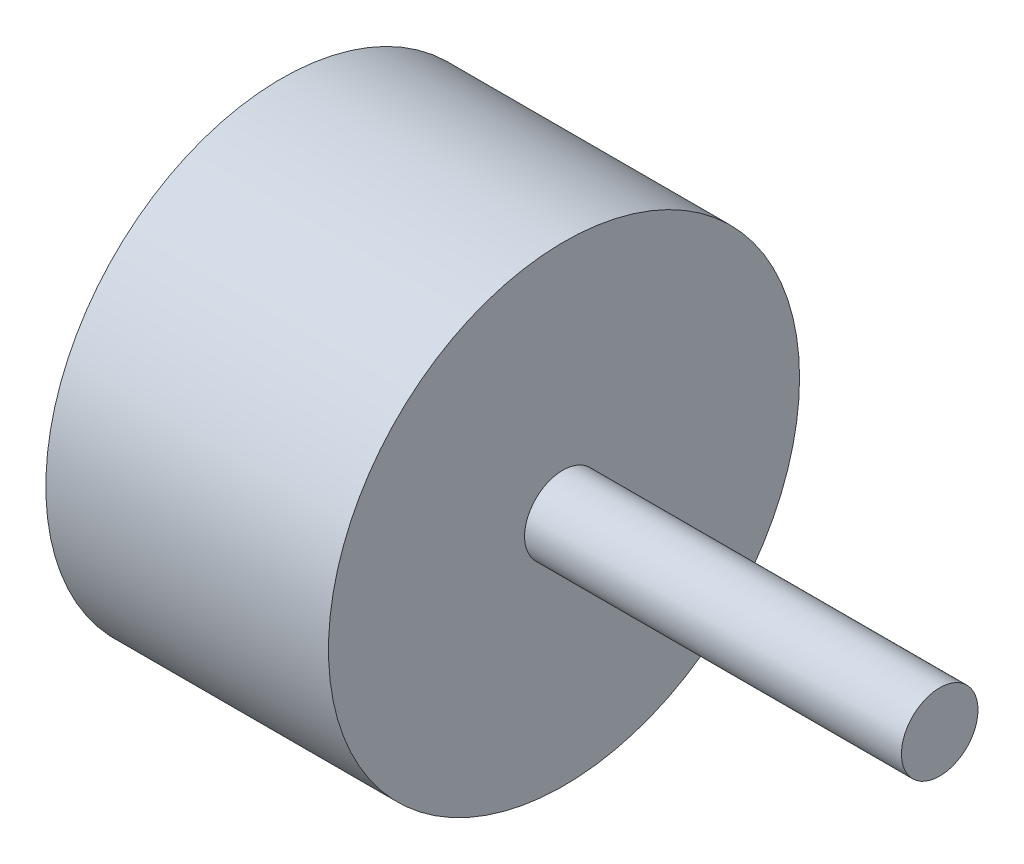
ISO-10303-21;
HEADER;
FILE_DESCRIPTION(('STEP AP214'),'2;1');
FILE_NAME('part.step','',(''),(''),'','','');
FILE_SCHEMA(('AUTOMOTIVE_DESIGN { 1 0 10303 214 1 1 1 1 }'));
ENDSEC;
DATA;
#1=APPLICATION_CONTEXT('core data for automotive mechanical design processes');
#2=APPLICATION_PROTOCOL_DEFINITION('international standard','automotive_design',2000,#1);
#3=PRODUCT_CONTEXT('',#1,'mechanical');
#4=PRODUCT('Part','Part','',(#3));
#5=PRODUCT_RELATED_PRODUCT_CATEGORY('part','',(#4));
#6=PRODUCT_DEFINITION_FORMATION('','',#4);
#7=PRODUCT_DEFINITION_CONTEXT('part definition',#1,'design');
#8=PRODUCT_DEFINITION('design','',#6,#7);
#9=PRODUCT_DEFINITION_SHAPE('','',#8);
#10=(LENGTH_UNIT() NAMED_UNIT(*) SI_UNIT(.MILLI.,.METRE.));
#11=(NAMED_UNIT(*) PLANE_ANGLE_UNIT() SI_UNIT($,.RADIAN.));
#12=(NAMED_UNIT(*) SI_UNIT($,.STERADIAN.) SOLID_ANGLE_UNIT());
#13=UNCERTAINTY_MEASURE_WITH_UNIT(LENGTH_MEASURE(1.E-05),#10,'distance_accuracy_value','');
#14=(GEOMETRIC_REPRESENTATION_CONTEXT(3) GLOBAL_UNCERTAINTY_ASSIGNED_CONTEXT((#13)) GLOBAL_UNIT_ASSIGNED_CONTEXT((#10,
#11,#12)) REPRESENTATION_CONTEXT('',''));
#15=CARTESIAN_POINT('',(0.,0.,0.));
#16=DIRECTION('',(0.,0.,1.));
#17=DIRECTION('',(1.,0.,0.));
#18=AXIS2_PLACEMENT_3D('',#15,#16,#17);
#19=CARTESIAN_POINT('',(300.,0.,-1.22811488686301));
#20=DIRECTION('',(-1.,0.,0.));
#21=DIRECTION('',(0.,0.,1.));
#22=AXIS2_PLACEMENT_3D('',#19,#20,#21);
#23=CYLINDRICAL_SURFACE('',#22,250.);
#24=CARTESIAN_POINT('',(300.,0.,-1.22811488686301));
#25=DIRECTION('',(1.,0.,0.));
#26=DIRECTION('',(0.,0.,-1.));
#27=AXIS2_PLACEMENT_3D('',#24,#25,#26);
#28=CIRCLE('',#27,250.);
#29=CARTESIAN_POINT('',(300.,0.,-251.228114886863));
#30=VERTEX_POINT('',#29);
#31=EDGE_CURVE('E38',#30,#30,#28,.T.);
#32=ORIENTED_EDGE('',*,*,#31,.F.);
#33=EDGE_LOOP('',(#32));
#34=FACE_BOUND('',#33,.T.);
#35=CARTESIAN_POINT('',(0.,0.,-1.22811488686301));
#36=DIRECTION('',(1.,0.,0.));
#37=DIRECTION('',(0.,0.,-1.));
#38=AXIS2_PLACEMENT_3D('',#35,#36,#37);
#39=CIRCLE('',#38,250.);
#40=CARTESIAN_POINT('',(0.,0.,-251.228114886863));
#41=VERTEX_POINT('',#40);
#42=EDGE_CURVE('E34',#41,#41,#39,.T.);
#43=ORIENTED_EDGE('',*,*,#42,.T.);
#44=EDGE_LOOP('',(#43));
#45=FACE_BOUND('',#44,.T.);
#46=ADVANCED_FACE('F31',(#34,#45),#23,.T.);
#47=CARTESIAN_POINT('',(300.,0.,-1.22811488686301));
#48=DIRECTION('',(1.,0.,0.));
#49=DIRECTION('',(0.,0.,-1.));
#50=AXIS2_PLACEMENT_3D('',#47,#48,#49);
#51=PLANE('',#50);
#52=CARTESIAN_POINT('',(300.,0.,0.));
#53=DIRECTION('',(1.,0.,0.));
#54=DIRECTION('',(0.,0.,-1.));
#55=AXIS2_PLACEMENT_3D('',#52,#53,#54);
#56=CIRCLE('',#55,40.6260611478171);
#57=CARTESIAN_POINT('',(300.,0.,-40.6260611478171));
#58=VERTEX_POINT('',#57);
#59=EDGE_CURVE('E10',#58,#58,#56,.T.);
#60=ORIENTED_EDGE('',*,*,#59,.F.);
#61=EDGE_LOOP('',(#60));
#62=FACE_BOUND('',#61,.T.);
#63=ORIENTED_EDGE('',*,*,#31,.T.);
#64=EDGE_LOOP('',(#63));
#65=FACE_BOUND('',#64,.T.);
#66=ADVANCED_FACE('F55',(#62,#65),#51,.T.);
#67=CARTESIAN_POINT('',(0.,0.,-1.22811488686301));
#68=DIRECTION('',(1.,0.,0.));
#69=DIRECTION('',(0.,0.,-1.));
#70=AXIS2_PLACEMENT_3D('',#67,#68,#69);
#71=PLANE('',#70);
#72=ORIENTED_EDGE('',*,*,#42,.F.);
#73=EDGE_LOOP('',(#72));
#74=FACE_BOUND('',#73,.T.);
#75=ADVANCED_FACE('F52',(#74),#71,.F.);
#76=CARTESIAN_POINT('',(700.,0.,0.));
#77=DIRECTION('',(-1.,0.,0.));
#78=DIRECTION('',(0.,0.,1.));
#79=AXIS2_PLACEMENT_3D('',#76,#77,#78);
#80=CYLINDRICAL_SURFACE('',#79,40.6260611478171);
#81=CARTESIAN_POINT('',(700.,0.,0.));
#82=DIRECTION('',(1.,0.,0.));
#83=DIRECTION('',(0.,0.,-1.));
#84=AXIS2_PLACEMENT_3D('',#81,#82,#83);
#85=CIRCLE('',#84,40.6260611478171);
#86=CARTESIAN_POINT('',(700.,0.,-40.6260611478171));
#87=VERTEX_POINT('',#86);
#88=EDGE_CURVE('E44',#87,#87,#85,.T.);
#89=ORIENTED_EDGE('',*,*,#88,.F.);
#90=EDGE_LOOP('',(#89));
#91=FACE_BOUND('',#90,.T.);
#92=ORIENTED_EDGE('',*,*,#59,.T.);
#93=EDGE_LOOP('',(#92));
#94=FACE_BOUND('',#93,.T.);
#95=ADVANCED_FACE('F54',(#91,#94),#80,.T.);
#96=CARTESIAN_POINT('',(700.,0.,0.));
#97=DIRECTION('',(1.,0.,0.));
#98=DIRECTION('',(0.,0.,-1.));
#99=AXIS2_PLACEMENT_3D('',#96,#97,#98);
#100=PLANE('',#99);
#101=ORIENTED_EDGE('',*,*,#88,.T.);
#102=EDGE_LOOP('',(#101));
#103=FACE_BOUND('',#102,.T.);
#104=ADVANCED_FACE('F60',(#103),#100,.T.);
#105=CLOSED_SHELL('',(#46,#66,#75,#95,#104));
#106=MANIFOLD_SOLID_BREP('B2',#105);
#107=ADVANCED_BREP_SHAPE_REPRESENTATION('',(#18,#106),#14);
#108=SHAPE_DEFINITION_REPRESENTATION(#9,#107);
ENDSEC;
END-ISO-10303-21;
